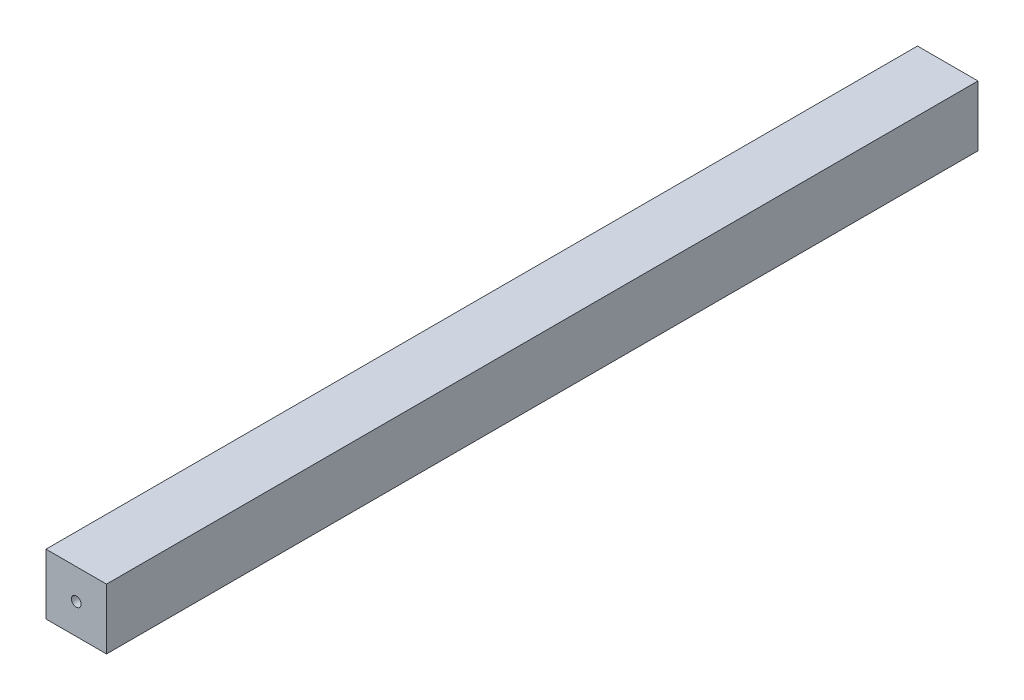
ISO-10303-21;
HEADER;
FILE_DESCRIPTION(('STEP AP214'),'2;1');
FILE_NAME('part.step','',(''),(''),'','','');
FILE_SCHEMA(('AUTOMOTIVE_DESIGN { 1 0 10303 214 1 1 1 1 }'));
ENDSEC;
DATA;
#1=APPLICATION_CONTEXT('core data for automotive mechanical design processes');
#2=APPLICATION_PROTOCOL_DEFINITION('international standard','automotive_design',2000,#1);
#3=PRODUCT_CONTEXT('',#1,'mechanical');
#4=PRODUCT('Part','Part','',(#3));
#5=PRODUCT_RELATED_PRODUCT_CATEGORY('part','',(#4));
#6=PRODUCT_DEFINITION_FORMATION('','',#4);
#7=PRODUCT_DEFINITION_CONTEXT('part definition',#1,'design');
#8=PRODUCT_DEFINITION('design','',#6,#7);
#9=PRODUCT_DEFINITION_SHAPE('','',#8);
#10=(LENGTH_UNIT() NAMED_UNIT(*) SI_UNIT(.MILLI.,.METRE.));
#11=(NAMED_UNIT(*) PLANE_ANGLE_UNIT() SI_UNIT($,.RADIAN.));
#12=(NAMED_UNIT(*) SI_UNIT($,.STERADIAN.) SOLID_ANGLE_UNIT());
#13=UNCERTAINTY_MEASURE_WITH_UNIT(LENGTH_MEASURE(1.E-05),#10,'distance_accuracy_value','');
#14=(GEOMETRIC_REPRESENTATION_CONTEXT(3) GLOBAL_UNCERTAINTY_ASSIGNED_CONTEXT((#13)) GLOBAL_UNIT_ASSIGNED_CONTEXT((#10,
#11,#12)) REPRESENTATION_CONTEXT('',''));
#15=CARTESIAN_POINT('',(0.,0.,0.));
#16=DIRECTION('',(0.,0.,1.));
#17=DIRECTION('',(1.,0.,0.));
#18=AXIS2_PLACEMENT_3D('',#15,#16,#17);
#19=CARTESIAN_POINT('',(25.,-25.,720.));
#20=DIRECTION('',(-1.,0.,0.));
#21=DIRECTION('',(0.,0.,1.));
#22=AXIS2_PLACEMENT_3D('',#19,#20,#21);
#23=PLANE('',#22);
#24=DIRECTION('',(0.,1.,0.));
#25=VECTOR('',#24,1.);
#26=CARTESIAN_POINT('',(25.,-25.,0.));
#27=LINE('',#26,#25);
#28=CARTESIAN_POINT('',(25.,-25.,0.));
#29=VERTEX_POINT('',#28);
#30=CARTESIAN_POINT('',(25.,25.,0.));
#31=VERTEX_POINT('',#30);
#32=EDGE_CURVE('E105',#29,#31,#27,.T.);
#33=ORIENTED_EDGE('',*,*,#32,.T.);
#34=DIRECTION('',(0.,0.,-1.));
#35=VECTOR('',#34,1.);
#36=CARTESIAN_POINT('',(25.,25.,720.));
#37=LINE('',#36,#35);
#38=CARTESIAN_POINT('',(25.,25.,720.));
#39=VERTEX_POINT('',#38);
#40=EDGE_CURVE('E11',#39,#31,#37,.T.);
#41=ORIENTED_EDGE('',*,*,#40,.F.);
#42=DIRECTION('',(0.,1.,0.));
#43=VECTOR('',#42,1.);
#44=CARTESIAN_POINT('',(25.,-25.,720.));
#45=LINE('',#44,#43);
#46=CARTESIAN_POINT('',(25.,-25.,720.));
#47=VERTEX_POINT('',#46);
#48=EDGE_CURVE('E89',#47,#39,#45,.T.);
#49=ORIENTED_EDGE('',*,*,#48,.F.);
#50=DIRECTION('',(0.,0.,-1.));
#51=VECTOR('',#50,1.);
#52=CARTESIAN_POINT('',(25.,-25.,720.));
#53=LINE('',#52,#51);
#54=EDGE_CURVE('E98',#47,#29,#53,.T.);
#55=ORIENTED_EDGE('',*,*,#54,.T.);
#56=EDGE_LOOP('',(#33,#41,#49,#55));
#57=FACE_BOUND('',#56,.T.);
#58=ADVANCED_FACE('F39',(#57),#23,.F.);
#59=CARTESIAN_POINT('',(-25.,25.,720.));
#60=DIRECTION('',(0.,-1.,0.));
#61=DIRECTION('',(0.,0.,-1.));
#62=AXIS2_PLACEMENT_3D('',#59,#60,#61);
#63=PLANE('',#62);
#64=DIRECTION('',(-1.,0.,0.));
#65=VECTOR('',#64,1.);
#66=CARTESIAN_POINT('',(-25.,25.,0.));
#67=LINE('',#66,#65);
#68=CARTESIAN_POINT('',(-25.,25.,0.));
#69=VERTEX_POINT('',#68);
#70=EDGE_CURVE('E94',#31,#69,#67,.T.);
#71=ORIENTED_EDGE('',*,*,#70,.T.);
#72=DIRECTION('',(0.,0.,-1.));
#73=VECTOR('',#72,1.);
#74=CARTESIAN_POINT('',(-25.,25.,720.));
#75=LINE('',#74,#73);
#76=CARTESIAN_POINT('',(-25.,25.,720.));
#77=VERTEX_POINT('',#76);
#78=EDGE_CURVE('E50',#77,#69,#75,.T.);
#79=ORIENTED_EDGE('',*,*,#78,.F.);
#80=DIRECTION('',(-1.,0.,0.));
#81=VECTOR('',#80,1.);
#82=CARTESIAN_POINT('',(-25.,25.,720.));
#83=LINE('',#82,#81);
#84=EDGE_CURVE('E82',#39,#77,#83,.T.);
#85=ORIENTED_EDGE('',*,*,#84,.F.);
#86=ORIENTED_EDGE('',*,*,#40,.T.);
#87=EDGE_LOOP('',(#71,#79,#85,#86));
#88=FACE_BOUND('',#87,.T.);
#89=ADVANCED_FACE('F91',(#88),#63,.F.);
#90=CARTESIAN_POINT('',(-25.,-25.,720.));
#91=DIRECTION('',(1.,0.,0.));
#92=DIRECTION('',(0.,0.,-1.));
#93=AXIS2_PLACEMENT_3D('',#90,#91,#92);
#94=PLANE('',#93);
#95=DIRECTION('',(0.,-1.,0.));
#96=VECTOR('',#95,1.);
#97=CARTESIAN_POINT('',(-25.,-25.,0.));
#98=LINE('',#97,#96);
#99=CARTESIAN_POINT('',(-25.,-25.,0.));
#100=VERTEX_POINT('',#99);
#101=EDGE_CURVE('E75',#69,#100,#98,.T.);
#102=ORIENTED_EDGE('',*,*,#101,.T.);
#103=DIRECTION('',(0.,0.,-1.));
#104=VECTOR('',#103,1.);
#105=CARTESIAN_POINT('',(-25.,-25.,720.));
#106=LINE('',#105,#104);
#107=CARTESIAN_POINT('',(-25.,-25.,720.));
#108=VERTEX_POINT('',#107);
#109=EDGE_CURVE('E92',#108,#100,#106,.T.);
#110=ORIENTED_EDGE('',*,*,#109,.F.);
#111=DIRECTION('',(0.,-1.,0.));
#112=VECTOR('',#111,1.);
#113=CARTESIAN_POINT('',(-25.,-25.,720.));
#114=LINE('',#113,#112);
#115=EDGE_CURVE('E86',#77,#108,#114,.T.);
#116=ORIENTED_EDGE('',*,*,#115,.F.);
#117=ORIENTED_EDGE('',*,*,#78,.T.);
#118=EDGE_LOOP('',(#102,#110,#116,#117));
#119=FACE_BOUND('',#118,.T.);
#120=ADVANCED_FACE('F96',(#119),#94,.F.);
#121=CARTESIAN_POINT('',(-25.,-25.,720.));
#122=DIRECTION('',(0.,1.,0.));
#123=DIRECTION('',(0.,0.,1.));
#124=AXIS2_PLACEMENT_3D('',#121,#122,#123);
#125=PLANE('',#124);
#126=DIRECTION('',(1.,0.,0.));
#127=VECTOR('',#126,1.);
#128=CARTESIAN_POINT('',(-25.,-25.,0.));
#129=LINE('',#128,#127);
#130=EDGE_CURVE('E77',#100,#29,#129,.T.);
#131=ORIENTED_EDGE('',*,*,#130,.T.);
#132=ORIENTED_EDGE('',*,*,#54,.F.);
#133=DIRECTION('',(1.,0.,0.));
#134=VECTOR('',#133,1.);
#135=CARTESIAN_POINT('',(-25.,-25.,720.));
#136=LINE('',#135,#134);
#137=EDGE_CURVE('E54',#108,#47,#136,.T.);
#138=ORIENTED_EDGE('',*,*,#137,.F.);
#139=ORIENTED_EDGE('',*,*,#109,.T.);
#140=EDGE_LOOP('',(#131,#132,#138,#139));
#141=FACE_BOUND('',#140,.T.);
#142=ADVANCED_FACE('F109',(#141),#125,.F.);
#143=CARTESIAN_POINT('',(0.,0.,720.));
#144=DIRECTION('',(0.,0.,-1.));
#145=DIRECTION('',(-1.,0.,0.));
#146=AXIS2_PLACEMENT_3D('',#143,#144,#145);
#147=PLANE('',#146);
#148=CARTESIAN_POINT('',(0.,0.,720.));
#149=DIRECTION('',(0.,0.,1.));
#150=DIRECTION('',(1.,0.,0.));
#151=AXIS2_PLACEMENT_3D('',#148,#149,#150);
#152=CIRCLE('',#151,4.);
#153=CARTESIAN_POINT('',(4.,0.,720.));
#154=VERTEX_POINT('',#153);
#155=EDGE_CURVE('E118',#154,#154,#152,.T.);
#156=ORIENTED_EDGE('',*,*,#155,.F.);
#157=EDGE_LOOP('',(#156));
#158=FACE_BOUND('',#157,.T.);
#159=ORIENTED_EDGE('',*,*,#48,.T.);
#160=ORIENTED_EDGE('',*,*,#84,.T.);
#161=ORIENTED_EDGE('',*,*,#115,.T.);
#162=ORIENTED_EDGE('',*,*,#137,.T.);
#163=EDGE_LOOP('',(#159,#160,#161,#162));
#164=FACE_BOUND('',#163,.T.);
#165=ADVANCED_FACE('F88',(#158,#164),#147,.F.);
#166=CARTESIAN_POINT('',(0.,0.,0.));
#167=DIRECTION('',(0.,0.,-1.));
#168=DIRECTION('',(-1.,0.,0.));
#169=AXIS2_PLACEMENT_3D('',#166,#167,#168);
#170=PLANE('',#169);
#171=ORIENTED_EDGE('',*,*,#32,.F.);
#172=ORIENTED_EDGE('',*,*,#130,.F.);
#173=ORIENTED_EDGE('',*,*,#101,.F.);
#174=ORIENTED_EDGE('',*,*,#70,.F.);
#175=EDGE_LOOP('',(#171,#172,#173,#174));
#176=FACE_BOUND('',#175,.T.);
#177=ADVANCED_FACE('F114',(#176),#170,.T.);
#178=CARTESIAN_POINT('',(0.,0.,690.));
#179=DIRECTION('',(0.,0.,1.));
#180=DIRECTION('',(1.,0.,0.));
#181=AXIS2_PLACEMENT_3D('',#178,#179,#180);
#182=CYLINDRICAL_SURFACE('',#181,4.);
#183=CARTESIAN_POINT('',(0.,0.,690.));
#184=DIRECTION('',(0.,0.,1.));
#185=DIRECTION('',(1.,0.,0.));
#186=AXIS2_PLACEMENT_3D('',#183,#184,#185);
#187=CIRCLE('',#186,4.);
#188=CARTESIAN_POINT('',(4.,0.,690.));
#189=VERTEX_POINT('',#188);
#190=EDGE_CURVE('E104',#189,#189,#187,.T.);
#191=ORIENTED_EDGE('',*,*,#190,.F.);
#192=EDGE_LOOP('',(#191));
#193=FACE_BOUND('',#192,.T.);
#194=ORIENTED_EDGE('',*,*,#155,.T.);
#195=EDGE_LOOP('',(#194));
#196=FACE_BOUND('',#195,.T.);
#197=ADVANCED_FACE('F124',(#193,#196),#182,.F.);
#198=CARTESIAN_POINT('',(0.,0.,690.));
#199=DIRECTION('',(0.,0.,1.));
#200=DIRECTION('',(1.,0.,0.));
#201=AXIS2_PLACEMENT_3D('',#198,#199,#200);
#202=PLANE('',#201);
#203=ORIENTED_EDGE('',*,*,#190,.T.);
#204=EDGE_LOOP('',(#203));
#205=FACE_BOUND('',#204,.T.);
#206=ADVANCED_FACE('F125',(#205),#202,.T.);
#207=CLOSED_SHELL('',(#58,#89,#120,#142,#165,#177,#197,#206));
#208=MANIFOLD_SOLID_BREP('B2',#207);
#209=ADVANCED_BREP_SHAPE_REPRESENTATION('',(#18,#208),#14);
#210=SHAPE_DEFINITION_REPRESENTATION(#9,#209);
ENDSEC;
END-ISO-10303-21;
